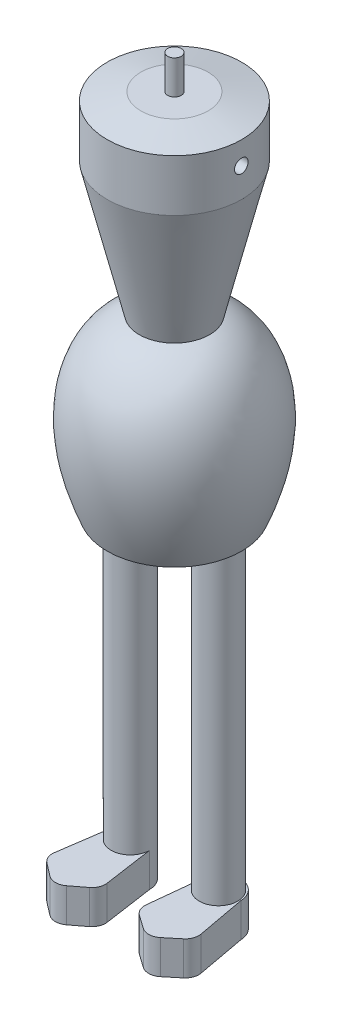
ISO-10303-21;
HEADER;
FILE_DESCRIPTION(('STEP AP214'),'2;1');
FILE_NAME('part.step','',(''),(''),'','','');
FILE_SCHEMA(('AUTOMOTIVE_DESIGN { 1 0 10303 214 1 1 1 1 }'));
ENDSEC;
DATA;
#1=APPLICATION_CONTEXT('core data for automotive mechanical design processes');
#2=APPLICATION_PROTOCOL_DEFINITION('international standard','automotive_design',2000,#1);
#3=PRODUCT_CONTEXT('',#1,'mechanical');
#4=PRODUCT('Part','Part','',(#3));
#5=PRODUCT_RELATED_PRODUCT_CATEGORY('part','',(#4));
#6=PRODUCT_DEFINITION_FORMATION('','',#4);
#7=PRODUCT_DEFINITION_CONTEXT('part definition',#1,'design');
#8=PRODUCT_DEFINITION('design','',#6,#7);
#9=PRODUCT_DEFINITION_SHAPE('','',#8);
#10=(LENGTH_UNIT() NAMED_UNIT(*) SI_UNIT(.MILLI.,.METRE.));
#11=(NAMED_UNIT(*) PLANE_ANGLE_UNIT() SI_UNIT($,.RADIAN.));
#12=(NAMED_UNIT(*) SI_UNIT($,.STERADIAN.) SOLID_ANGLE_UNIT());
#13=UNCERTAINTY_MEASURE_WITH_UNIT(LENGTH_MEASURE(1.E-05),#10,'distance_accuracy_value','');
#14=(GEOMETRIC_REPRESENTATION_CONTEXT(3) GLOBAL_UNCERTAINTY_ASSIGNED_CONTEXT((#13)) GLOBAL_UNIT_ASSIGNED_CONTEXT((#10,
#11,#12)) REPRESENTATION_CONTEXT('',''));
#15=CARTESIAN_POINT('',(0.,0.,0.));
#16=DIRECTION('',(0.,0.,1.));
#17=DIRECTION('',(1.,0.,0.));
#18=AXIS2_PLACEMENT_3D('',#15,#16,#17);
#19=CARTESIAN_POINT('',(0.,53.6546413411295,0.));
#20=DIRECTION('',(0.,1.,0.));
#21=DIRECTION('',(0.,0.,1.));
#22=AXIS2_PLACEMENT_3D('',#19,#20,#21);
#23=CYLINDRICAL_SURFACE('',#22,9.91246763759848);
#24=CARTESIAN_POINT('',(0.,27.2820210209133,0.));
#25=DIRECTION('',(0.,1.,0.));
#26=DIRECTION('',(0.,0.,1.));
#27=AXIS2_PLACEMENT_3D('',#24,#25,#26);
#28=CIRCLE('',#27,9.91246763759848);
#29=CARTESIAN_POINT('',(0.,27.2820210209133,9.91246763759848));
#30=VERTEX_POINT('',#29);
#31=EDGE_CURVE('E468',#30,#30,#28,.T.);
#32=ORIENTED_EDGE('',*,*,#31,.F.);
#33=EDGE_LOOP('',(#32));
#34=FACE_BOUND('',#33,.T.);
#35=CARTESIAN_POINT('',(0.,19.6430551350576,0.));
#36=DIRECTION('',(0.,1.,0.));
#37=DIRECTION('',(0.,0.,1.));
#38=AXIS2_PLACEMENT_3D('',#35,#36,#37);
#39=CIRCLE('',#38,9.91246763759848);
#40=CARTESIAN_POINT('',(0.,19.6430551350576,9.91246763759848));
#41=VERTEX_POINT('',#40);
#42=EDGE_CURVE('E471',#41,#41,#39,.T.);
#43=ORIENTED_EDGE('',*,*,#42,.T.);
#44=EDGE_LOOP('',(#43));
#45=FACE_BOUND('',#44,.T.);
#46=CARTESIAN_POINT('',(-9.8618971129513,23.9362823058489,1.));
#47=CARTESIAN_POINT('',(-9.86189777524261,23.9922991898953,0.999997574784623));
#48=CARTESIAN_POINT('',(-9.86237953195626,24.0483530484495,0.995277309922573));
#49=CARTESIAN_POINT('',(-9.8642542243653,24.1589064662983,0.976518656409124));
#50=CARTESIAN_POINT('',(-9.86564816255343,24.2134042466029,0.962470015568449));
#51=CARTESIAN_POINT('',(-9.86918775384349,24.3192285294165,0.925468018658358));
#52=CARTESIAN_POINT('',(-9.87133294942783,24.3705569397501,0.902520081370942));
#53=CARTESIAN_POINT('',(-9.87613278323589,24.4686224840881,0.848381344987756));
#54=CARTESIAN_POINT('',(-9.87878732069727,24.5153605234383,0.817192175782723));
#55=CARTESIAN_POINT('',(-9.8843177359631,24.6031025022267,0.747332408466979));
#56=CARTESIAN_POINT('',(-9.88719431306254,24.6440870759646,0.708637540536115));
#57=CARTESIAN_POINT('',(-9.89283834324895,24.7189919491841,0.624916651579463));
#58=CARTESIAN_POINT('',(-9.89560579132496,24.7529119245803,0.579890340260151));
#59=CARTESIAN_POINT('',(-9.90072665926403,24.8127917383258,0.484665983732102));
#60=CARTESIAN_POINT('',(-9.90307918258635,24.8387344276271,0.434457102393798));
#61=CARTESIAN_POINT('',(-9.90709752356021,24.8818135341651,0.330368065721891));
#62=CARTESIAN_POINT('',(-9.90876335822507,24.898950169582,0.27648800138359));
#63=CARTESIAN_POINT('',(-9.91121571892736,24.9238738977643,0.166781773045071));
#64=CARTESIAN_POINT('',(-9.91200523631881,24.9316928038528,0.110962904517751));
#65=CARTESIAN_POINT('',(-9.91262617960286,24.9378575642681,-0.00120002986843441));
#66=CARTESIAN_POINT('',(-9.91245763074357,24.9362036682335,-0.0575440818479688));
#67=CARTESIAN_POINT('',(-9.91118388014935,24.9234955877367,-0.168942001858916));
#68=CARTESIAN_POINT('',(-9.91008208711724,24.9124756126638,-0.223999816858196));
#69=CARTESIAN_POINT('',(-9.90706958396251,24.8814014901214,-0.331480436251494));
#70=CARTESIAN_POINT('',(-9.90515886317269,24.8613472235181,-0.383903205887446));
#71=CARTESIAN_POINT('',(-9.90073745853246,24.8127363117825,-0.484733414427269));
#72=CARTESIAN_POINT('',(-9.89822570879733,24.784164539039,-0.533133511575995));
#73=CARTESIAN_POINT('',(-9.89288405868692,24.7193406483162,-0.62446436276818));
#74=CARTESIAN_POINT('',(-9.89005414881522,24.6830883010593,-0.667394953476764));
#75=CARTESIAN_POINT('',(-9.88437884810208,24.6037399640181,-0.7467685377382));
#76=CARTESIAN_POINT('',(-9.88153344444583,24.5606142136038,-0.783181785742086));
#77=CARTESIAN_POINT('',(-9.87616042506852,24.4688464058732,-0.848256728938907));
#78=CARTESIAN_POINT('',(-9.87363280982196,24.4202043403207,-0.876918412558173));
#79=CARTESIAN_POINT('',(-9.86918132843441,24.3187616972321,-0.92567654176949));
#80=CARTESIAN_POINT('',(-9.86725759306286,24.2659602220734,-0.945771132505041));
#81=CARTESIAN_POINT('',(-9.86423436606986,24.157708973625,-0.976801034542922));
#82=CARTESIAN_POINT('',(-9.86313484888217,24.1022592825365,-0.987736629947264));
#83=CARTESIAN_POINT('',(-9.86188897631334,23.9905467997434,-1.00009982093608));
#84=CARTESIAN_POINT('',(-9.86173844847355,23.9342886589577,-1.0015690383443));
#85=CARTESIAN_POINT('',(-9.86239658543658,23.8223269800234,-0.995067091682364));
#86=CARTESIAN_POINT('',(-9.86320523704464,23.7666234342563,-0.987096057475102));
#87=CARTESIAN_POINT('',(-9.8656868208889,23.657473594568,-0.961974705950307));
#88=CARTESIAN_POINT('',(-9.86735789842471,23.6040227218857,-0.94484408405558));
#89=CARTESIAN_POINT('',(-9.8713745387021,23.5007531461725,-0.901909945356364));
#90=CARTESIAN_POINT('',(-9.87372011715904,23.4509345278042,-0.876106226473165));
#91=CARTESIAN_POINT('',(-9.87883156576801,23.3561539596966,-0.81645416132579));
#92=CARTESIAN_POINT('',(-9.88159886443457,23.3112094411516,-0.782578243120618));
#93=CARTESIAN_POINT('',(-9.88723727601645,23.2276296814586,-0.70778289424361));
#94=CARTESIAN_POINT('',(-9.89010839154662,23.1889945993628,-0.666863286063678));
#95=CARTESIAN_POINT('',(-9.89564353352538,23.1189868035289,-0.578961510574311));
#96=CARTESIAN_POINT('',(-9.89830676173301,23.0876412482795,-0.531957656097865));
#97=CARTESIAN_POINT('',(-9.90311442136439,23.0332892111111,-0.433328724451929));
#98=CARTESIAN_POINT('',(-9.90525886000604,23.0102826131702,-0.381703711590149));
#99=CARTESIAN_POINT('',(-9.90878371501308,22.9733075435076,-0.275392566801817));
#100=CARTESIAN_POINT('',(-9.91016551546472,22.9593226906823,-0.220712179988747));
#101=CARTESIAN_POINT('',(-9.91201508266067,22.9407346336477,-0.10976475005734));
#102=CARTESIAN_POINT('',(-9.91248287558134,22.9361311607637,-0.0534977524249416));
#103=CARTESIAN_POINT('',(-9.91245170299397,22.9364403557481,0.0587589733248549));
#104=CARTESIAN_POINT('',(-9.91195701976338,22.9413108716411,0.114748823503551));
#105=CARTESIAN_POINT('',(-9.91006493145315,22.9603413704608,0.225110605340522));
#106=CARTESIAN_POINT('',(-9.90866752569962,22.9745013603222,0.279482535790954));
#107=CARTESIAN_POINT('',(-9.9051265534781,23.011697129178,0.385064567918011));
#108=CARTESIAN_POINT('',(-9.90298309279396,23.0347316498934,0.436275116638658));
#109=CARTESIAN_POINT('',(-9.89818889275895,23.0890181247579,0.534109686274732));
#110=CARTESIAN_POINT('',(-9.89553815608645,23.1202700355203,0.580733731404465));
#111=CARTESIAN_POINT('',(-9.89001222635786,23.1902621617522,0.668287803274798));
#112=CARTESIAN_POINT('',(-9.88713612372187,23.2290337639266,0.709192682108379));
#113=CARTESIAN_POINT('',(-9.88149129461868,23.3129026738614,0.783934460090197));
#114=CARTESIAN_POINT('',(-9.8787225940728,23.3580014967101,0.817769661519823));
#115=CARTESIAN_POINT('',(-9.87359839418046,23.4533723860685,0.877480840334768));
#116=CARTESIAN_POINT('',(-9.87124398069672,23.50365751523,0.903336031557831));
#117=CARTESIAN_POINT('',(-9.86722786151464,23.6078473120377,0.946201212242865));
#118=CARTESIAN_POINT('',(-9.86556537578326,23.6617478238778,0.963221167342472));
#119=CARTESIAN_POINT('',(-9.8635401094935,23.7526743221321,0.983693815763366));
#120=CARTESIAN_POINT('',(-9.86292690433524,23.7891192279565,0.989800264303532));
#121=CARTESIAN_POINT('',(-9.86210518869802,23.8624648395252,0.997954146854487));
#122=CARTESIAN_POINT('',(-9.86189667648198,23.8993655433123,1.00000159828776));
#123=CARTESIAN_POINT('',(-9.8618971129513,23.9362823058489,1.));
#124=B_SPLINE_CURVE_WITH_KNOTS('',3,(#46,#47,#48,#49,#50,#51,#52,#53,#54,#55,#56,#57,#58,#59,
#60,#61,#62,#63,#64,#65,#66,#67,#68,#69,#70,#71,#72,#73,#74,#75,#76,#77,#78,#79,#80,#81,#82,#83,
#84,#85,#86,#87,#88,#89,#90,#91,#92,#93,#94,#95,#96,#97,#98,#99,#100,#101,#102,#103,#104,#105,
#106,#107,#108,#109,#110,#111,#112,#113,#114,#115,#116,#117,#118,#119,#120,#121,#122,#123),
.UNSPECIFIED.,.T.,.F.,(4,2,2,2,2,2,2,2,2,2,2,2,2,2,2,2,2,2,2,2,2,2,2,2,2,2,2,2,2,2,2,2,2,2,2,2,
2,2,4),(0.,0.167915837051277,0.336016525208888,0.504015017156937,0.671980308424872,
0.840498055771571,1.00902353209383,1.17790880075623,1.34678988488751,1.51509269466586,
1.68339106914753,1.85107736634687,2.01876587486402,2.18675400100522,2.35474714256993,
2.5234884798402,2.69223006905262,2.86100817388186,3.02978104320506,3.19781134171247,
3.3658393287722,3.53350745776932,3.70117949361865,3.8694326646841,4.03769007652019,
4.2065646636003,4.37543690099895,4.54400164154351,4.71256155447358,4.88037322040368,
5.04818501160874,5.21597301830353,5.38376013911909,5.55226328010106,5.72080683918862,
5.88978578238165,6.05857371063425,6.16923562616035,6.27989706668988),.UNSPECIFIED.);
#125=CARTESIAN_POINT('',(-9.8618971129513,23.9362823058489,1.));
#126=VERTEX_POINT('',#125);
#127=EDGE_CURVE('E268',#126,#126,#124,.T.);
#128=ORIENTED_EDGE('',*,*,#127,.F.);
#129=EDGE_LOOP('',(#128));
#130=FACE_BOUND('',#129,.T.);
#131=CARTESIAN_POINT('',(9.8618971129513,23.9362823058489,1.));
#132=CARTESIAN_POINT('',(9.86189777524261,23.8802654218025,0.999997574784623));
#133=CARTESIAN_POINT('',(9.86237953195626,23.8242115632483,0.995277309922573));
#134=CARTESIAN_POINT('',(9.8642542243653,23.7136581453995,0.976518656409123));
#135=CARTESIAN_POINT('',(9.86564816255343,23.6591603650949,0.962470015568448));
#136=CARTESIAN_POINT('',(9.86918775384349,23.5533360822813,0.925468018658357));
#137=CARTESIAN_POINT('',(9.87133294942783,23.5020076719477,0.902520081370941));
#138=CARTESIAN_POINT('',(9.87613278323589,23.4039421276096,0.848381344987754));
#139=CARTESIAN_POINT('',(9.87878732069727,23.3572040882595,0.817192175782721));
#140=CARTESIAN_POINT('',(9.8843177359631,23.2694621094711,0.747332408466976));
#141=CARTESIAN_POINT('',(9.88719431306254,23.2284775357331,0.708637540536111));
#142=CARTESIAN_POINT('',(9.89283834324895,23.1535726625137,0.624916651579459));
#143=CARTESIAN_POINT('',(9.89560579132496,23.1196526871175,0.579890340260147));
#144=CARTESIAN_POINT('',(9.90072665926403,23.0597728733719,0.484665983732097));
#145=CARTESIAN_POINT('',(9.90307918258635,23.0338301840706,0.434457102393793));
#146=CARTESIAN_POINT('',(9.90709752356021,22.9907510775327,0.330368065721886));
#147=CARTESIAN_POINT('',(9.90876335822508,22.9736144421158,0.276488001383585));
#148=CARTESIAN_POINT('',(9.91121571892737,22.9486907139335,0.166781773045067));
#149=CARTESIAN_POINT('',(9.91200523631882,22.940871807845,0.110962904517746));
#150=CARTESIAN_POINT('',(9.91262617960286,22.9347070474297,-0.00120002986843953));
#151=CARTESIAN_POINT('',(9.91245763074357,22.9363609434643,-0.0575440818479738));
#152=CARTESIAN_POINT('',(9.91118388014935,22.9490690239611,-0.16894200185892));
#153=CARTESIAN_POINT('',(9.91008208711724,22.960088999034,-0.2239998168582));
#154=CARTESIAN_POINT('',(9.90706958396251,22.9911631215764,-0.331480436251497));
#155=CARTESIAN_POINT('',(9.90515886317269,23.0112173881797,-0.383903205887448));
#156=CARTESIAN_POINT('',(9.90073745853246,23.0598282999153,-0.48473341442727));
#157=CARTESIAN_POINT('',(9.89822570879733,23.0884000726588,-0.533133511575996));
#158=CARTESIAN_POINT('',(9.89288405868691,23.1532239633816,-0.624464362768181));
#159=CARTESIAN_POINT('',(9.89005414881522,23.1894763106384,-0.667394953476764));
#160=CARTESIAN_POINT('',(9.88437884810208,23.2688246476797,-0.7467685377382));
#161=CARTESIAN_POINT('',(9.88153344444583,23.3119503980939,-0.783181785742086));
#162=CARTESIAN_POINT('',(9.87616042506852,23.4037182058246,-0.848256728938907));
#163=CARTESIAN_POINT('',(9.87363280982196,23.452360271377,-0.876918412558173));
#164=CARTESIAN_POINT('',(9.86918132843441,23.5538029144657,-0.92567654176949));
#165=CARTESIAN_POINT('',(9.86725759306286,23.6066043896244,-0.945771132505042));
#166=CARTESIAN_POINT('',(9.86423436606986,23.7148556380728,-0.976801034542923));
#167=CARTESIAN_POINT('',(9.86313484888217,23.7703053291612,-0.987736629947264));
#168=CARTESIAN_POINT('',(9.86188897631334,23.8820178119544,-1.00009982093608));
#169=CARTESIAN_POINT('',(9.86173844847355,23.9382759527401,-1.0015690383443));
#170=CARTESIAN_POINT('',(9.86239658543658,24.0502376316744,-0.995067091682364));
#171=CARTESIAN_POINT('',(9.86320523704464,24.1059411774415,-0.987096057475102));
#172=CARTESIAN_POINT('',(9.8656868208889,24.2150910171298,-0.961974705950306));
#173=CARTESIAN_POINT('',(9.86735789842471,24.268541889812,-0.944844084055579));
#174=CARTESIAN_POINT('',(9.8713745387021,24.3718114655252,-0.901909945356362));
#175=CARTESIAN_POINT('',(9.87372011715904,24.4216300838936,-0.876106226473162));
#176=CARTESIAN_POINT('',(9.87883156576801,24.5164106520011,-0.816454161325785));
#177=CARTESIAN_POINT('',(9.88159886443457,24.5613551705462,-0.782578243120612));
#178=CARTESIAN_POINT('',(9.88723727601645,24.6449349302391,-0.707782894243604));
#179=CARTESIAN_POINT('',(9.89010839154662,24.683570012335,-0.666863286063674));
#180=CARTESIAN_POINT('',(9.89564353352538,24.7535778081689,-0.578961510574306));
#181=CARTESIAN_POINT('',(9.89830676173301,24.7849233634182,-0.53195765609786));
#182=CARTESIAN_POINT('',(9.90311442136439,24.8392754005867,-0.433328724451924));
#183=CARTESIAN_POINT('',(9.90525886000604,24.8622819985276,-0.381703711590145));
#184=CARTESIAN_POINT('',(9.90878371501308,24.8992570681902,-0.275392566801813));
#185=CARTESIAN_POINT('',(9.91016551546472,24.9132419210154,-0.220712179988742));
#186=CARTESIAN_POINT('',(9.91201508266067,24.9318299780501,-0.109764750057335));
#187=CARTESIAN_POINT('',(9.91248287558134,24.9364334509341,-0.0534977524249364));
#188=CARTESIAN_POINT('',(9.91245170299397,24.9361242559497,0.0587589733248594));
#189=CARTESIAN_POINT('',(9.91195701976338,24.9312537400567,0.114748823503555));
#190=CARTESIAN_POINT('',(9.91006493145315,24.912223241237,0.225110605340524));
#191=CARTESIAN_POINT('',(9.90866752569962,24.8980632513755,0.279482535790957));
#192=CARTESIAN_POINT('',(9.9051265534781,24.8608674825198,0.385064567918013));
#193=CARTESIAN_POINT('',(9.90298309279396,24.8378329618044,0.43627511663866));
#194=CARTESIAN_POINT('',(9.89818889275895,24.7835464869399,0.534109686274733));
#195=CARTESIAN_POINT('',(9.89553815608645,24.7522945761775,0.580733731404466));
#196=CARTESIAN_POINT('',(9.89001222635786,24.6823024499456,0.668287803274798));
#197=CARTESIAN_POINT('',(9.88713612372187,24.6435308477712,0.709192682108379));
#198=CARTESIAN_POINT('',(9.88149129461868,24.5596619378364,0.783934460090198));
#199=CARTESIAN_POINT('',(9.8787225940728,24.5145631149877,0.817769661519824));
#200=CARTESIAN_POINT('',(9.87359839418046,24.4191922256293,0.877480840334768));
#201=CARTESIAN_POINT('',(9.87124398069672,24.3689070964677,0.90333603155783));
#202=CARTESIAN_POINT('',(9.86722786151464,24.26471729966,0.946201212242864));
#203=CARTESIAN_POINT('',(9.86556537578326,24.21081678782,0.963221167342472));
#204=CARTESIAN_POINT('',(9.8635401094935,24.1198902895657,0.983693815763366));
#205=CARTESIAN_POINT('',(9.86292690433524,24.0834453837412,0.989800264303531));
#206=CARTESIAN_POINT('',(9.86210518869802,24.0100997721725,0.997954146854487));
#207=CARTESIAN_POINT('',(9.86189667648198,23.9731990683854,1.00000159828776));
#208=CARTESIAN_POINT('',(9.8618971129513,23.9362823058489,1.));
#209=B_SPLINE_CURVE_WITH_KNOTS('',3,(#131,#132,#133,#134,#135,#136,#137,#138,#139,#140,#141,
#142,#143,#144,#145,#146,#147,#148,#149,#150,#151,#152,#153,#154,#155,#156,#157,#158,#159,#160,
#161,#162,#163,#164,#165,#166,#167,#168,#169,#170,#171,#172,#173,#174,#175,#176,#177,#178,#179,
#180,#181,#182,#183,#184,#185,#186,#187,#188,#189,#190,#191,#192,#193,#194,#195,#196,#197,#198,
#199,#200,#201,#202,#203,#204,#205,#206,#207,#208),.UNSPECIFIED.,.T.,.F.,(4,2,2,2,2,2,2,2,2,2,2,
2,2,2,2,2,2,2,2,2,2,2,2,2,2,2,2,2,2,2,2,2,2,2,2,2,2,2,4),(0.,0.167915837051281,
0.336016525208891,0.504015017156938,0.671980308424876,0.840498055771576,1.00902353209383,
1.17790880075624,1.34678988488751,1.51509269466586,1.68339106914754,1.85107736634688,
2.01876587486402,2.18675400100522,2.35474714256993,2.5234884798402,2.69223006905262,
2.86100817388186,3.02978104320507,3.19781134171247,3.36583932877221,3.53350745776933,
3.70117949361866,3.8694326646841,4.0376900765202,4.20656466360031,4.37543690099895,
4.54400164154351,4.71256155447358,4.88037322040369,5.04818501160875,5.21597301830354,
5.38376013911909,5.55226328010106,5.72080683918862,5.88978578238165,6.05857371063425,
6.16923562616034,6.27989706668988),.UNSPECIFIED.);
#210=CARTESIAN_POINT('',(9.8618971129513,23.9362823058489,1.));
#211=VERTEX_POINT('',#210);
#212=EDGE_CURVE('E45',#211,#211,#209,.T.);
#213=ORIENTED_EDGE('',*,*,#212,.F.);
#214=EDGE_LOOP('',(#213));
#215=FACE_BOUND('',#214,.T.);
#216=ADVANCED_FACE('F41',(#34,#45,#130,#215),#23,.T.);
#217=CARTESIAN_POINT('',(6.49714255543264,-70.2813394934491,0.));
#218=DIRECTION('',(0.,1.,0.));
#219=DIRECTION('',(0.,0.,1.));
#220=AXIS2_PLACEMENT_3D('',#217,#218,#219);
#221=PLANE('',#220);
#222=CARTESIAN_POINT('',(6.6473711879431,-70.2813394934491,-0.2558870503321));
#223=DIRECTION('',(0.,-1.,0.));
#224=DIRECTION('',(0.,0.,1.));
#225=AXIS2_PLACEMENT_3D('',#222,#223,#224);
#226=CIRCLE('',#225,2.83366023965534);
#227=CARTESIAN_POINT('',(3.81585789262201,-70.2813394934491,-0.145601909794655));
#228=VERTEX_POINT('',#227);
#229=CARTESIAN_POINT('',(4.13195726197364,-70.2813394934491,-1.56061810876614));
#230=VERTEX_POINT('',#229);
#231=EDGE_CURVE('E217',#228,#230,#226,.T.);
#232=ORIENTED_EDGE('',*,*,#231,.F.);
#233=DIRECTION('',(0.105003114397173,0.,-0.994471892999945));
#234=VECTOR('',#233,1.);
#235=CARTESIAN_POINT('',(3.81585789262201,-70.2813394934491,-0.145601909794655));
#236=LINE('',#235,#234);
#237=CARTESIAN_POINT('',(3.73410339693447,-70.2813394934491,0.628685105922907));
#238=VERTEX_POINT('',#237);
#239=EDGE_CURVE('E208',#238,#228,#236,.T.);
#240=ORIENTED_EDGE('',*,*,#239,.F.);
#241=CARTESIAN_POINT('',(6.49714255543264,-70.2813394934491,0.));
#242=DIRECTION('',(0.,-1.,0.));
#243=DIRECTION('',(0.,0.,1.));
#244=AXIS2_PLACEMENT_3D('',#241,#242,#243);
#245=CIRCLE('',#244,2.83366023965534);
#246=EDGE_CURVE('E192',#238,#230,#245,.T.);
#247=ORIENTED_EDGE('',*,*,#246,.T.);
#248=EDGE_LOOP('',(#232,#240,#247));
#249=FACE_BOUND('',#248,.T.);
#250=ADVANCED_FACE('F264',(#249),#221,.F.);
#251=CARTESIAN_POINT('',(0.,28.4751884217354,0.));
#252=DIRECTION('',(0.,-1.,0.));
#253=DIRECTION('',(0.,0.,-1.));
#254=AXIS2_PLACEMENT_3D('',#251,#252,#253);
#255=PLANE('',#254);
#256=CARTESIAN_POINT('',(0.,28.4751884217354,0.));
#257=DIRECTION('',(0.,1.,0.));
#258=DIRECTION('',(0.,0.,1.));
#259=AXIS2_PLACEMENT_3D('',#256,#257,#258);
#260=CIRCLE('',#259,1.);
#261=CARTESIAN_POINT('',(0.,28.4751884217354,1.));
#262=VERTEX_POINT('',#261);
#263=EDGE_CURVE('E11',#262,#262,#260,.T.);
#264=ORIENTED_EDGE('',*,*,#263,.F.);
#265=EDGE_LOOP('',(#264));
#266=FACE_BOUND('',#265,.T.);
#267=CARTESIAN_POINT('',(0.,28.4751884217354,0.));
#268=DIRECTION('',(0.,1.,0.));
#269=DIRECTION('',(0.,0.,1.));
#270=AXIS2_PLACEMENT_3D('',#267,#268,#269);
#271=CIRCLE('',#270,4.95623381879924);
#272=CARTESIAN_POINT('',(0.,28.4751884217354,4.95623381879924));
#273=VERTEX_POINT('',#272);
#274=EDGE_CURVE('E357',#273,#273,#271,.T.);
#275=ORIENTED_EDGE('',*,*,#274,.T.);
#276=EDGE_LOOP('',(#275));
#277=FACE_BOUND('',#276,.T.);
#278=ADVANCED_FACE('F340',(#266,#277),#255,.F.);
#279=CARTESIAN_POINT('',(0.,27.2820210209133,0.));
#280=DIRECTION('',(0.,-1.,0.));
#281=DIRECTION('',(0.,0.,-1.));
#282=AXIS2_PLACEMENT_3D('',#279,#280,#281);
#283=CONICAL_SURFACE('',#282,9.91246763759848,1.33455106607646);
#284=ORIENTED_EDGE('',*,*,#274,.F.);
#285=EDGE_LOOP('',(#284));
#286=FACE_BOUND('',#285,.T.);
#287=ORIENTED_EDGE('',*,*,#31,.T.);
#288=EDGE_LOOP('',(#287));
#289=FACE_BOUND('',#288,.T.);
#290=ADVANCED_FACE('F259',(#286,#289),#283,.T.);
#291=CARTESIAN_POINT('',(0.,0.,0.));
#292=DIRECTION('',(0.,1.,0.));
#293=DIRECTION('',(0.,0.,1.));
#294=AXIS2_PLACEMENT_3D('',#291,#292,#293);
#295=CONICAL_SURFACE('',#294,5.18358399397353,0.236245260718436);
#296=ORIENTED_EDGE('',*,*,#42,.F.);
#297=EDGE_LOOP('',(#296));
#298=FACE_BOUND('',#297,.T.);
#299=CARTESIAN_POINT('',(0.,0.,0.));
#300=DIRECTION('',(0.,1.,0.));
#301=DIRECTION('',(0.,0.,1.));
#302=AXIS2_PLACEMENT_3D('',#299,#300,#301);
#303=CIRCLE('',#302,5.18358399397353);
#304=CARTESIAN_POINT('',(0.,0.,5.18358399397353));
#305=VERTEX_POINT('',#304);
#306=EDGE_CURVE('E473',#305,#305,#303,.T.);
#307=ORIENTED_EDGE('',*,*,#306,.T.);
#308=EDGE_LOOP('',(#307));
#309=FACE_BOUND('',#308,.T.);
#310=ADVANCED_FACE('F255',(#298,#309),#295,.T.);
#311=CARTESIAN_POINT('',(-5.18358399397353,0.,0.));
#312=CARTESIAN_POINT('',(-8.57397898680744,-1.18888393522603,0.));
#313=CARTESIAN_POINT('',(-14.4922180718043,-9.39255896973497,0.));
#314=CARTESIAN_POINT('',(-12.1771908552131,-19.8409918904987,0.));
#315=CARTESIAN_POINT('',(-9.91246762974888,-25.2813394934491,0.));
#316=B_SPLINE_CURVE_WITH_KNOTS('',3,(#311,#312,#313,#314,#315),.UNSPECIFIED.,.F.,.F.,(4,1,4),
(0.,0.353823055643961,1.),.UNSPECIFIED.);
#317=CARTESIAN_POINT('',(0.,53.6546413411295,0.));
#318=DIRECTION('',(0.,1.,0.));
#319=AXIS1_PLACEMENT('',#317,#318);
#320=SURFACE_OF_REVOLUTION('',#316,#319);
#321=CARTESIAN_POINT('',(0.,-25.2813394934491,0.));
#322=DIRECTION('',(0.,1.,0.));
#323=DIRECTION('',(0.,0.,1.));
#324=AXIS2_PLACEMENT_3D('',#321,#322,#323);
#325=CIRCLE('',#324,9.91246762974888);
#326=CARTESIAN_POINT('',(0.,-25.2813394934491,9.91246762974888));
#327=VERTEX_POINT('',#326);
#328=EDGE_CURVE('E233',#327,#327,#325,.T.);
#329=ORIENTED_EDGE('',*,*,#328,.T.);
#330=EDGE_LOOP('',(#329));
#331=FACE_BOUND('',#330,.T.);
#332=ORIENTED_EDGE('',*,*,#306,.F.);
#333=EDGE_LOOP('',(#332));
#334=FACE_BOUND('',#333,.T.);
#335=ADVANCED_FACE('F250',(#331,#334),#320,.F.);
#336=CARTESIAN_POINT('',(0.,-25.2813394934491,0.));
#337=DIRECTION('',(0.,-1.,0.));
#338=DIRECTION('',(0.,0.,-1.));
#339=AXIS2_PLACEMENT_3D('',#336,#337,#338);
#340=PLANE('',#339);
#341=CARTESIAN_POINT('',(-6.49714255543264,-25.2813394934491,0.));
#342=DIRECTION('',(0.,-1.,0.));
#343=DIRECTION('',(0.,0.,-1.));
#344=AXIS2_PLACEMENT_3D('',#341,#342,#343);
#345=CIRCLE('',#344,2.83366023965534);
#346=CARTESIAN_POINT('',(-6.49714255543264,-25.2813394934491,-2.83366023965534));
#347=VERTEX_POINT('',#346);
#348=EDGE_CURVE('E234',#347,#347,#345,.T.);
#349=ORIENTED_EDGE('',*,*,#348,.F.);
#350=EDGE_LOOP('',(#349));
#351=FACE_BOUND('',#350,.T.);
#352=CARTESIAN_POINT('',(6.49714255543264,-25.2813394934491,0.));
#353=DIRECTION('',(0.,-1.,0.));
#354=DIRECTION('',(0.,0.,1.));
#355=AXIS2_PLACEMENT_3D('',#352,#353,#354);
#356=CIRCLE('',#355,2.83366023965534);
#357=CARTESIAN_POINT('',(6.49714255543264,-25.2813394934491,2.83366023965534));
#358=VERTEX_POINT('',#357);
#359=EDGE_CURVE('E237',#358,#358,#356,.T.);
#360=ORIENTED_EDGE('',*,*,#359,.F.);
#361=EDGE_LOOP('',(#360));
#362=FACE_BOUND('',#361,.T.);
#363=ORIENTED_EDGE('',*,*,#328,.F.);
#364=EDGE_LOOP('',(#363));
#365=FACE_BOUND('',#364,.T.);
#366=ADVANCED_FACE('F254',(#351,#362,#365),#340,.T.);
#367=CARTESIAN_POINT('',(6.49714255543264,-70.2813394934491,0.));
#368=DIRECTION('',(0.,1.,0.));
#369=DIRECTION('',(0.,0.,1.));
#370=AXIS2_PLACEMENT_3D('',#367,#368,#369);
#371=CYLINDRICAL_SURFACE('',#370,2.83366023965534);
#372=ORIENTED_EDGE('',*,*,#246,.F.);
#373=EDGE_CURVE('E188',#230,#238,#245,.T.);
#374=ORIENTED_EDGE('',*,*,#373,.F.);
#375=EDGE_LOOP('',(#372,#374));
#376=FACE_BOUND('',#375,.T.);
#377=ORIENTED_EDGE('',*,*,#359,.T.);
#378=EDGE_LOOP('',(#377));
#379=FACE_BOUND('',#378,.T.);
#380=ADVANCED_FACE('F336',(#376,#379),#371,.T.);
#381=CARTESIAN_POINT('',(-6.49714255543264,-70.2813394934491,0.));
#382=DIRECTION('',(0.,1.,0.));
#383=DIRECTION('',(0.,0.,1.));
#384=AXIS2_PLACEMENT_3D('',#381,#382,#383);
#385=CYLINDRICAL_SURFACE('',#384,2.83366023965534);
#386=CARTESIAN_POINT('',(-6.49714255543264,-70.2813394934491,0.));
#387=DIRECTION('',(0.,-1.,0.));
#388=DIRECTION('',(0.,0.,-1.));
#389=AXIS2_PLACEMENT_3D('',#386,#387,#388);
#390=CIRCLE('',#389,2.83366023965534);
#391=CARTESIAN_POINT('',(-3.6634823157773,-70.2813394934491,0.));
#392=VERTEX_POINT('',#391);
#393=CARTESIAN_POINT('',(-9.33080279508797,-70.2813394934491,0.));
#394=VERTEX_POINT('',#393);
#395=EDGE_CURVE('E186',#392,#394,#390,.T.);
#396=ORIENTED_EDGE('',*,*,#395,.F.);
#397=DIRECTION('',(0.,1.,0.));
#398=VECTOR('',#397,1.);
#399=CARTESIAN_POINT('',(-3.6634823157773,-75.2813394934491,0.));
#400=LINE('',#399,#398);
#401=CARTESIAN_POINT('',(-3.6634823157773,-75.2813394934491,0.));
#402=VERTEX_POINT('',#401);
#403=EDGE_CURVE('E169',#402,#392,#400,.T.);
#404=ORIENTED_EDGE('',*,*,#403,.F.);
#405=CARTESIAN_POINT('',(-6.49714255543263,-75.2813394934491,0.));
#406=DIRECTION('',(0.,-1.,0.));
#407=DIRECTION('',(0.,0.,-1.));
#408=AXIS2_PLACEMENT_3D('',#405,#406,#407);
#409=CIRCLE('',#408,2.83366023965534);
#410=CARTESIAN_POINT('',(-9.33080279508797,-75.2813394934491,0.));
#411=VERTEX_POINT('',#410);
#412=EDGE_CURVE('E171',#411,#402,#409,.T.);
#413=ORIENTED_EDGE('',*,*,#412,.F.);
#414=DIRECTION('',(0.,1.,0.));
#415=VECTOR('',#414,1.);
#416=CARTESIAN_POINT('',(-9.33080279508797,-75.2813394934491,0.));
#417=LINE('',#416,#415);
#418=EDGE_CURVE('E189',#411,#394,#417,.T.);
#419=ORIENTED_EDGE('',*,*,#418,.T.);
#420=EDGE_LOOP('',(#396,#404,#413,#419));
#421=FACE_BOUND('',#420,.T.);
#422=ORIENTED_EDGE('',*,*,#348,.T.);
#423=EDGE_LOOP('',(#422));
#424=FACE_BOUND('',#423,.T.);
#425=ADVANCED_FACE('F183',(#421,#424),#385,.T.);
#426=CARTESIAN_POINT('',(-6.49714255543263,-70.2813394934491,0.));
#427=DIRECTION('',(0.,-1.,0.));
#428=DIRECTION('',(0.,0.,-1.));
#429=AXIS2_PLACEMENT_3D('',#426,#427,#428);
#430=PLANE('',#429);
#431=DIRECTION('',(0.143628082594427,0.,-0.989631736501133));
#432=VECTOR('',#431,1.);
#433=CARTESIAN_POINT('',(-9.33080279508797,-70.2813394934491,0.));
#434=LINE('',#433,#432);
#435=CARTESIAN_POINT('',(-10.3914755888623,-70.2813394934491,7.30828846143132));
#436=VERTEX_POINT('',#435);
#437=EDGE_CURVE('E181',#436,#394,#434,.T.);
#438=ORIENTED_EDGE('',*,*,#437,.F.);
#439=CARTESIAN_POINT('',(-8.41221211585999,-70.2813394934491,7.59554462662017));
#440=DIRECTION('',(0.,-1.,0.));
#441=DIRECTION('',(0.,0.,-1.));
#442=AXIS2_PLACEMENT_3D('',#439,#440,#441);
#443=CIRCLE('',#442,2.);
#444=CARTESIAN_POINT('',(-9.62655578867738,-70.2813394934491,9.18468572931947));
#445=VERTEX_POINT('',#444);
#446=EDGE_CURVE('E380',#436,#445,#443,.F.);
#447=ORIENTED_EDGE('',*,*,#446,.T.);
#448=DIRECTION('',(-0.794570551349653,0.,-0.607171836408696));
#449=VECTOR('',#448,1.);
#450=CARTESIAN_POINT('',(-10.5602523541103,-70.2813394934491,8.47120061799811));
#451=LINE('',#450,#449);
#452=CARTESIAN_POINT('',(-7.71148622825003,-70.2813394934491,10.6480879405894));
#453=VERTEX_POINT('',#452);
#454=EDGE_CURVE('E398',#453,#445,#451,.T.);
#455=ORIENTED_EDGE('',*,*,#454,.F.);
#456=CARTESIAN_POINT('',(-6.49714255543264,-70.2813394934491,9.05894683789013));
#457=DIRECTION('',(0.,-1.,0.));
#458=DIRECTION('',(0.,0.,-1.));
#459=AXIS2_PLACEMENT_3D('',#456,#457,#458);
#460=CIRCLE('',#459,2.);
#461=CARTESIAN_POINT('',(-5.28279888261524,-70.2813394934491,10.6480879405894));
#462=VERTEX_POINT('',#461);
#463=EDGE_CURVE('E396',#453,#462,#460,.F.);
#464=ORIENTED_EDGE('',*,*,#463,.T.);
#465=DIRECTION('',(-0.794570551349653,0.,0.607171836408696));
#466=VECTOR('',#465,1.);
#467=CARTESIAN_POINT('',(-2.43403275675499,-70.2813394934491,8.47120061799811));
#468=LINE('',#467,#466);
#469=CARTESIAN_POINT('',(-3.36772932218788,-70.2813394934491,9.18468572931947));
#470=VERTEX_POINT('',#469);
#471=EDGE_CURVE('E391',#470,#462,#468,.T.);
#472=ORIENTED_EDGE('',*,*,#471,.F.);
#473=CARTESIAN_POINT('',(-4.58207299500528,-70.2813394934491,7.59554462662017));
#474=DIRECTION('',(0.,-1.,0.));
#475=DIRECTION('',(0.,0.,-1.));
#476=AXIS2_PLACEMENT_3D('',#473,#474,#475);
#477=CIRCLE('',#476,2.);
#478=CARTESIAN_POINT('',(-2.60280952200301,-70.2813394934491,7.30828846143132));
#479=VERTEX_POINT('',#478);
#480=EDGE_CURVE('E378',#470,#479,#477,.F.);
#481=ORIENTED_EDGE('',*,*,#480,.T.);
#482=DIRECTION('',(0.143628082594427,0.,0.989631736501133));
#483=VECTOR('',#482,1.);
#484=CARTESIAN_POINT('',(-3.6634823157773,-70.2813394934491,0.));
#485=LINE('',#484,#483);
#486=EDGE_CURVE('E220',#392,#479,#485,.T.);
#487=ORIENTED_EDGE('',*,*,#486,.F.);
#488=ORIENTED_EDGE('',*,*,#395,.T.);
#489=EDGE_LOOP('',(#438,#447,#455,#464,#472,#481,#487,#488));
#490=FACE_BOUND('',#489,.T.);
#491=ADVANCED_FACE('F289',(#490),#430,.F.);
#492=CARTESIAN_POINT('',(-3.6634823157773,-75.2813394934491,0.));
#493=DIRECTION('',(-0.989631736501133,0.,0.143628082594427));
#494=DIRECTION('',(0.143628082594427,0.,0.989631736501133));
#495=AXIS2_PLACEMENT_3D('',#492,#493,#494);
#496=PLANE('',#495);
#497=ORIENTED_EDGE('',*,*,#486,.T.);
#498=DIRECTION('',(0.,1.,0.));
#499=VECTOR('',#498,1.);
#500=CARTESIAN_POINT('',(-2.60280952200301,-75.2813394934491,7.30828846143131));
#501=LINE('',#500,#499);
#502=CARTESIAN_POINT('',(-2.60280952200301,-75.2813394934491,7.30828846143132));
#503=VERTEX_POINT('',#502);
#504=EDGE_CURVE('E55',#479,#503,#501,.F.);
#505=ORIENTED_EDGE('',*,*,#504,.T.);
#506=DIRECTION('',(0.143628082594427,0.,0.989631736501133));
#507=VECTOR('',#506,1.);
#508=CARTESIAN_POINT('',(-3.6634823157773,-75.2813394934491,0.));
#509=LINE('',#508,#507);
#510=EDGE_CURVE('E165',#402,#503,#509,.T.);
#511=ORIENTED_EDGE('',*,*,#510,.F.);
#512=ORIENTED_EDGE('',*,*,#403,.T.);
#513=EDGE_LOOP('',(#497,#505,#511,#512));
#514=FACE_BOUND('',#513,.T.);
#515=ADVANCED_FACE('F167',(#514),#496,.F.);
#516=CARTESIAN_POINT('',(-2.43403275675499,-75.2813394934491,8.47120061799811));
#517=DIRECTION('',(-0.607171836408696,0.,-0.794570551349653));
#518=DIRECTION('',(-0.794570551349653,0.,0.607171836408696));
#519=AXIS2_PLACEMENT_3D('',#516,#517,#518);
#520=PLANE('',#519);
#521=DIRECTION('',(-0.794570551349653,0.,0.607171836408696));
#522=VECTOR('',#521,1.);
#523=CARTESIAN_POINT('',(-2.43403275675499,-75.2813394934491,8.47120061799811));
#524=LINE('',#523,#522);
#525=CARTESIAN_POINT('',(-3.36772932218788,-75.2813394934491,9.18468572931947));
#526=VERTEX_POINT('',#525);
#527=CARTESIAN_POINT('',(-5.28279888261524,-75.2813394934491,10.6480879405894));
#528=VERTEX_POINT('',#527);
#529=EDGE_CURVE('E170',#526,#528,#524,.T.);
#530=ORIENTED_EDGE('',*,*,#529,.F.);
#531=DIRECTION('',(0.,1.,0.));
#532=VECTOR('',#531,1.);
#533=CARTESIAN_POINT('',(-3.36772932218789,-75.2813394934491,9.18468572931947));
#534=LINE('',#533,#532);
#535=EDGE_CURVE('E386',#526,#470,#534,.T.);
#536=ORIENTED_EDGE('',*,*,#535,.T.);
#537=ORIENTED_EDGE('',*,*,#471,.T.);
#538=DIRECTION('',(0.,1.,0.));
#539=VECTOR('',#538,1.);
#540=CARTESIAN_POINT('',(-5.28279888261524,-75.2813394934491,10.6480879405894));
#541=LINE('',#540,#539);
#542=EDGE_CURVE('E446',#462,#528,#541,.F.);
#543=ORIENTED_EDGE('',*,*,#542,.T.);
#544=EDGE_LOOP('',(#530,#536,#537,#543));
#545=FACE_BOUND('',#544,.T.);
#546=ADVANCED_FACE('F299',(#545),#520,.F.);
#547=CARTESIAN_POINT('',(-10.5602523541103,-75.2813394934491,8.47120061799811));
#548=DIRECTION('',(0.607171836408696,0.,-0.794570551349653));
#549=DIRECTION('',(-0.794570551349653,0.,-0.607171836408696));
#550=AXIS2_PLACEMENT_3D('',#547,#548,#549);
#551=PLANE('',#550);
#552=ORIENTED_EDGE('',*,*,#454,.T.);
#553=DIRECTION('',(0.,1.,0.));
#554=VECTOR('',#553,1.);
#555=CARTESIAN_POINT('',(-9.62655578867738,-75.2813394934491,9.18468572931947));
#556=LINE('',#555,#554);
#557=CARTESIAN_POINT('',(-9.62655578867738,-75.2813394934491,9.18468572931947));
#558=VERTEX_POINT('',#557);
#559=EDGE_CURVE('E382',#445,#558,#556,.F.);
#560=ORIENTED_EDGE('',*,*,#559,.T.);
#561=DIRECTION('',(-0.794570551349653,0.,-0.607171836408696));
#562=VECTOR('',#561,1.);
#563=CARTESIAN_POINT('',(-10.5602523541103,-75.2813394934491,8.47120061799811));
#564=LINE('',#563,#562);
#565=CARTESIAN_POINT('',(-7.71148622825003,-75.2813394934491,10.6480879405894));
#566=VERTEX_POINT('',#565);
#567=EDGE_CURVE('E682',#566,#558,#564,.T.);
#568=ORIENTED_EDGE('',*,*,#567,.F.);
#569=DIRECTION('',(0.,1.,0.));
#570=VECTOR('',#569,1.);
#571=CARTESIAN_POINT('',(-7.71148622825003,-75.2813394934491,10.6480879405894));
#572=LINE('',#571,#570);
#573=EDGE_CURVE('E437',#566,#453,#572,.T.);
#574=ORIENTED_EDGE('',*,*,#573,.T.);
#575=EDGE_LOOP('',(#552,#560,#568,#574));
#576=FACE_BOUND('',#575,.T.);
#577=ADVANCED_FACE('F295',(#576),#551,.F.);
#578=CARTESIAN_POINT('',(-9.33080279508797,-75.2813394934491,0.));
#579=DIRECTION('',(0.989631736501133,0.,0.143628082594427));
#580=DIRECTION('',(0.143628082594427,0.,-0.989631736501133));
#581=AXIS2_PLACEMENT_3D('',#578,#579,#580);
#582=PLANE('',#581);
#583=DIRECTION('',(0.143628082594427,0.,-0.989631736501133));
#584=VECTOR('',#583,1.);
#585=CARTESIAN_POINT('',(-9.33080279508797,-75.2813394934491,0.));
#586=LINE('',#585,#584);
#587=CARTESIAN_POINT('',(-10.3914755888623,-75.2813394934491,7.30828846143132));
#588=VERTEX_POINT('',#587);
#589=EDGE_CURVE('E177',#588,#411,#586,.T.);
#590=ORIENTED_EDGE('',*,*,#589,.F.);
#591=DIRECTION('',(0.,1.,0.));
#592=VECTOR('',#591,1.);
#593=CARTESIAN_POINT('',(-10.3914755888623,-75.2813394934491,7.30828846143131));
#594=LINE('',#593,#592);
#595=EDGE_CURVE('E371',#588,#436,#594,.T.);
#596=ORIENTED_EDGE('',*,*,#595,.T.);
#597=ORIENTED_EDGE('',*,*,#437,.T.);
#598=ORIENTED_EDGE('',*,*,#418,.F.);
#599=EDGE_LOOP('',(#590,#596,#597,#598));
#600=FACE_BOUND('',#599,.T.);
#601=ADVANCED_FACE('F288',(#600),#582,.F.);
#602=CARTESIAN_POINT('',(-6.49714255543263,-75.2813394934491,0.));
#603=DIRECTION('',(0.,-1.,0.));
#604=DIRECTION('',(0.,0.,-1.));
#605=AXIS2_PLACEMENT_3D('',#602,#603,#604);
#606=PLANE('',#605);
#607=ORIENTED_EDGE('',*,*,#567,.T.);
#608=CARTESIAN_POINT('',(-8.41221211585999,-75.2813394934491,7.59554462662017));
#609=DIRECTION('',(0.,-1.,0.));
#610=DIRECTION('',(0.,0.,-1.));
#611=AXIS2_PLACEMENT_3D('',#608,#609,#610);
#612=CIRCLE('',#611,2.);
#613=EDGE_CURVE('E385',#558,#588,#612,.T.);
#614=ORIENTED_EDGE('',*,*,#613,.T.);
#615=ORIENTED_EDGE('',*,*,#589,.T.);
#616=ORIENTED_EDGE('',*,*,#412,.T.);
#617=ORIENTED_EDGE('',*,*,#510,.T.);
#618=CARTESIAN_POINT('',(-4.58207299500528,-75.2813394934491,7.59554462662017));
#619=DIRECTION('',(0.,-1.,0.));
#620=DIRECTION('',(0.,0.,-1.));
#621=AXIS2_PLACEMENT_3D('',#618,#619,#620);
#622=CIRCLE('',#621,2.);
#623=EDGE_CURVE('E69',#503,#526,#622,.T.);
#624=ORIENTED_EDGE('',*,*,#623,.T.);
#625=ORIENTED_EDGE('',*,*,#529,.T.);
#626=CARTESIAN_POINT('',(-6.49714255543264,-75.2813394934491,9.05894683789013));
#627=DIRECTION('',(0.,-1.,0.));
#628=DIRECTION('',(0.,0.,-1.));
#629=AXIS2_PLACEMENT_3D('',#626,#627,#628);
#630=CIRCLE('',#629,2.);
#631=EDGE_CURVE('E448',#528,#566,#630,.T.);
#632=ORIENTED_EDGE('',*,*,#631,.T.);
#633=EDGE_LOOP('',(#607,#614,#615,#616,#617,#624,#625,#632));
#634=FACE_BOUND('',#633,.T.);
#635=ADVANCED_FACE('F175',(#634),#606,.T.);
#636=CARTESIAN_POINT('',(6.6473711879431,-75.2813394934491,-0.2558870503321));
#637=DIRECTION('',(0.,1.,0.));
#638=DIRECTION('',(0.,0.,1.));
#639=AXIS2_PLACEMENT_3D('',#636,#637,#638);
#640=CYLINDRICAL_SURFACE('',#639,2.83366023965534);
#641=ORIENTED_EDGE('',*,*,#231,.T.);
#642=CARTESIAN_POINT('',(9.47888448326421,-70.2813394934491,-0.366172190869558));
#643=VERTEX_POINT('',#642);
#644=EDGE_CURVE('E216',#230,#643,#226,.T.);
#645=ORIENTED_EDGE('',*,*,#644,.T.);
#646=DIRECTION('',(0.,1.,0.));
#647=VECTOR('',#646,1.);
#648=CARTESIAN_POINT('',(9.47888448326421,-75.2813394934491,-0.366172190869558));
#649=LINE('',#648,#647);
#650=CARTESIAN_POINT('',(9.47888448326421,-75.2813394934491,-0.366172190869558));
#651=VERTEX_POINT('',#650);
#652=EDGE_CURVE('E197',#651,#643,#649,.T.);
#653=ORIENTED_EDGE('',*,*,#652,.F.);
#654=CARTESIAN_POINT('',(6.6473711879431,-75.2813394934491,-0.2558870503321));
#655=DIRECTION('',(0.,-1.,0.));
#656=DIRECTION('',(0.,0.,1.));
#657=AXIS2_PLACEMENT_3D('',#654,#655,#656);
#658=CIRCLE('',#657,2.83366023965534);
#659=CARTESIAN_POINT('',(3.81585789262201,-75.2813394934491,-0.145601909794655));
#660=VERTEX_POINT('',#659);
#661=EDGE_CURVE('E207',#660,#651,#658,.T.);
#662=ORIENTED_EDGE('',*,*,#661,.F.);
#663=DIRECTION('',(0.,1.,0.));
#664=VECTOR('',#663,1.);
#665=CARTESIAN_POINT('',(3.81585789262201,-75.2813394934491,-0.145601909794655));
#666=LINE('',#665,#664);
#667=EDGE_CURVE('E200',#660,#228,#666,.T.);
#668=ORIENTED_EDGE('',*,*,#667,.T.);
#669=EDGE_LOOP('',(#641,#645,#653,#662,#668));
#670=FACE_BOUND('',#669,.T.);
#671=ADVANCED_FACE('F287',(#670),#640,.T.);
#672=CARTESIAN_POINT('',(9.47888448326421,-75.2813394934491,-0.366172190869558));
#673=DIRECTION('',(-0.983291975907289,0.,0.182035408963034));
#674=DIRECTION('',(0.182035408963034,0.,0.983291975907289));
#675=AXIS2_PLACEMENT_3D('',#672,#673,#674);
#676=PLANE('',#675);
#677=DIRECTION('',(0.182035408963034,0.,0.983291975907289));
#678=VECTOR('',#677,1.);
#679=CARTESIAN_POINT('',(9.47888448326421,-70.2813394934491,-0.366172190869558));
#680=LINE('',#679,#678);
#681=CARTESIAN_POINT('',(10.8231898746818,-70.2813394934491,6.89529804769429));
#682=VERTEX_POINT('',#681);
#683=EDGE_CURVE('E213',#643,#682,#680,.T.);
#684=ORIENTED_EDGE('',*,*,#683,.T.);
#685=DIRECTION('',(0.,1.,0.));
#686=VECTOR('',#685,1.);
#687=CARTESIAN_POINT('',(10.8231898746818,-75.2813394934491,6.89529804769429));
#688=LINE('',#687,#686);
#689=CARTESIAN_POINT('',(10.8231898746818,-75.2813394934491,6.89529804769429));
#690=VERTEX_POINT('',#689);
#691=EDGE_CURVE('E456',#682,#690,#688,.F.);
#692=ORIENTED_EDGE('',*,*,#691,.T.);
#693=DIRECTION('',(0.182035408963034,0.,0.983291975907289));
#694=VECTOR('',#693,1.);
#695=CARTESIAN_POINT('',(9.47888448326421,-75.2813394934491,-0.366172190869558));
#696=LINE('',#695,#694);
#697=EDGE_CURVE('E227',#651,#690,#696,.T.);
#698=ORIENTED_EDGE('',*,*,#697,.F.);
#699=ORIENTED_EDGE('',*,*,#652,.T.);
#700=EDGE_LOOP('',(#684,#692,#698,#699));
#701=FACE_BOUND('',#700,.T.);
#702=ADVANCED_FACE('F308',(#701),#676,.F.);
#703=CARTESIAN_POINT('',(11.0370989301424,-75.2813394934491,8.05076037783336));
#704=DIRECTION('',(-0.637636237038086,0.,-0.770337607296898));
#705=DIRECTION('',(-0.770337607296898,0.,0.637636237038086));
#706=AXIS2_PLACEMENT_3D('',#703,#704,#705);
#707=PLANE('',#706);
#708=DIRECTION('',(-0.770337607296898,0.,0.637636237038086));
#709=VECTOR('',#708,1.);
#710=CARTESIAN_POINT('',(11.0370989301424,-75.2813394934491,8.05076037783336));
#711=LINE('',#710,#709);
#712=CARTESIAN_POINT('',(10.1318783969434,-75.2813394934491,8.80004408021415));
#713=VERTEX_POINT('',#712);
#714=CARTESIAN_POINT('',(8.27521494461579,-75.2813394934491,10.3368714218554));
#715=VERTEX_POINT('',#714);
#716=EDGE_CURVE('E225',#713,#715,#711,.T.);
#717=ORIENTED_EDGE('',*,*,#716,.F.);
#718=DIRECTION('',(0.,1.,0.));
#719=VECTOR('',#718,1.);
#720=CARTESIAN_POINT('',(10.1318783969434,-75.2813394934491,8.80004408021415));
#721=LINE('',#720,#719);
#722=CARTESIAN_POINT('',(10.1318783969434,-70.2813394934491,8.80004408021415));
#723=VERTEX_POINT('',#722);
#724=EDGE_CURVE('E450',#713,#723,#721,.T.);
#725=ORIENTED_EDGE('',*,*,#724,.T.);
#726=DIRECTION('',(-0.770337607296898,0.,0.637636237038086));
#727=VECTOR('',#726,1.);
#728=CARTESIAN_POINT('',(11.0370989301424,-70.2813394934491,8.05076037783336));
#729=LINE('',#728,#727);
#730=CARTESIAN_POINT('',(8.27521494461579,-70.2813394934491,10.3368714218554));
#731=VERTEX_POINT('',#730);
#732=EDGE_CURVE('E211',#723,#731,#729,.T.);
#733=ORIENTED_EDGE('',*,*,#732,.T.);
#734=DIRECTION('',(0.,1.,0.));
#735=VECTOR('',#734,1.);
#736=CARTESIAN_POINT('',(8.27521494461579,-75.2813394934491,10.3368714218554));
#737=LINE('',#736,#735);
#738=EDGE_CURVE('E434',#731,#715,#737,.F.);
#739=ORIENTED_EDGE('',*,*,#738,.T.);
#740=EDGE_LOOP('',(#717,#725,#733,#739));
#741=FACE_BOUND('',#740,.T.);
#742=ADVANCED_FACE('F312',(#741),#707,.F.);
#743=CARTESIAN_POINT('',(2.91703622516224,-75.2813394934491,8.36703021773538));
#744=DIRECTION('',(0.575787379016085,0.,-0.817599470502389));
#745=DIRECTION('',(-0.817599470502389,0.,-0.575787379016085));
#746=AXIS2_PLACEMENT_3D('',#743,#744,#745);
#747=PLANE('',#746);
#748=DIRECTION('',(-0.817599470502389,0.,-0.575787379016085));
#749=VECTOR('',#748,1.);
#750=CARTESIAN_POINT('',(2.91703622516224,-70.2813394934491,8.36703021773538));
#751=LINE('',#750,#749);
#752=CARTESIAN_POINT('',(5.84836771250744,-70.2813394934491,10.4313951482664));
#753=VERTEX_POINT('',#752);
#754=CARTESIAN_POINT('',(3.87779397815364,-70.2813394934491,9.04363558310381));
#755=VERTEX_POINT('',#754);
#756=EDGE_CURVE('E206',#753,#755,#751,.T.);
#757=ORIENTED_EDGE('',*,*,#756,.T.);
#758=DIRECTION('',(0.,1.,0.));
#759=VECTOR('',#758,1.);
#760=CARTESIAN_POINT('',(3.87779397815364,-75.2813394934491,9.04363558310381));
#761=LINE('',#760,#759);
#762=CARTESIAN_POINT('',(3.87779397815364,-75.2813394934491,9.04363558310381));
#763=VERTEX_POINT('',#762);
#764=EDGE_CURVE('E368',#755,#763,#761,.F.);
#765=ORIENTED_EDGE('',*,*,#764,.T.);
#766=DIRECTION('',(-0.817599470502389,0.,-0.575787379016085));
#767=VECTOR('',#766,1.);
#768=CARTESIAN_POINT('',(2.91703622516224,-75.2813394934491,8.36703021773538));
#769=LINE('',#768,#767);
#770=CARTESIAN_POINT('',(5.84836771250744,-75.2813394934491,10.4313951482664));
#771=VERTEX_POINT('',#770);
#772=EDGE_CURVE('E222',#771,#763,#769,.T.);
#773=ORIENTED_EDGE('',*,*,#772,.F.);
#774=DIRECTION('',(0.,1.,0.));
#775=VECTOR('',#774,1.);
#776=CARTESIAN_POINT('',(5.84836771250744,-75.2813394934491,10.4313951482664));
#777=LINE('',#776,#775);
#778=EDGE_CURVE('E356',#771,#753,#777,.T.);
#779=ORIENTED_EDGE('',*,*,#778,.T.);
#780=EDGE_LOOP('',(#757,#765,#773,#779));
#781=FACE_BOUND('',#780,.T.);
#782=ADVANCED_FACE('F316',(#781),#747,.F.);
#783=CARTESIAN_POINT('',(3.81585789262201,-75.2813394934491,-0.145601909794655));
#784=DIRECTION('',(0.994471892999945,0.,0.105003114397173));
#785=DIRECTION('',(0.105003114397173,0.,-0.994471892999945));
#786=AXIS2_PLACEMENT_3D('',#783,#784,#785);
#787=PLANE('',#786);
#788=DIRECTION('',(0.105003114397173,0.,-0.994471892999945));
#789=VECTOR('',#788,1.);
#790=CARTESIAN_POINT('',(3.81585789262201,-75.2813394934491,-0.145601909794655));
#791=LINE('',#790,#789);
#792=CARTESIAN_POINT('',(3.04042495018592,-75.2813394934491,7.19843041330469));
#793=VERTEX_POINT('',#792);
#794=EDGE_CURVE('E203',#793,#660,#791,.T.);
#795=ORIENTED_EDGE('',*,*,#794,.F.);
#796=DIRECTION('',(0.,1.,0.));
#797=VECTOR('',#796,1.);
#798=CARTESIAN_POINT('',(3.04042495018592,-75.2813394934491,7.19843041330469));
#799=LINE('',#798,#797);
#800=CARTESIAN_POINT('',(3.04042495018592,-70.2813394934491,7.19843041330469));
#801=VERTEX_POINT('',#800);
#802=EDGE_CURVE('E363',#793,#801,#799,.T.);
#803=ORIENTED_EDGE('',*,*,#802,.T.);
#804=EDGE_CURVE('E204',#801,#238,#236,.T.);
#805=ORIENTED_EDGE('',*,*,#804,.T.);
#806=ORIENTED_EDGE('',*,*,#239,.T.);
#807=ORIENTED_EDGE('',*,*,#667,.F.);
#808=EDGE_LOOP('',(#795,#803,#805,#806,#807));
#809=FACE_BOUND('',#808,.T.);
#810=ADVANCED_FACE('F320',(#809),#787,.F.);
#811=CARTESIAN_POINT('',(6.6473711879431,-75.2813394934491,-0.2558870503321));
#812=DIRECTION('',(0.,1.,0.));
#813=DIRECTION('',(0.,0.,1.));
#814=AXIS2_PLACEMENT_3D('',#811,#812,#813);
#815=PLANE('',#814);
#816=ORIENTED_EDGE('',*,*,#697,.T.);
#817=CARTESIAN_POINT('',(8.85660592286727,-75.2813394934491,7.25936886562036));
#818=DIRECTION('',(0.,1.,0.));
#819=DIRECTION('',(0.,0.,1.));
#820=AXIS2_PLACEMENT_3D('',#817,#818,#819);
#821=CIRCLE('',#820,2.);
#822=EDGE_CURVE('E369',#690,#713,#821,.F.);
#823=ORIENTED_EDGE('',*,*,#822,.T.);
#824=ORIENTED_EDGE('',*,*,#716,.T.);
#825=CARTESIAN_POINT('',(6.99994247053961,-75.2813394934491,8.79619620726157));
#826=DIRECTION('',(0.,1.,0.));
#827=DIRECTION('',(0.,0.,1.));
#828=AXIS2_PLACEMENT_3D('',#825,#826,#827);
#829=CIRCLE('',#828,2.);
#830=EDGE_CURVE('E432',#715,#771,#829,.F.);
#831=ORIENTED_EDGE('',*,*,#830,.T.);
#832=ORIENTED_EDGE('',*,*,#772,.T.);
#833=CARTESIAN_POINT('',(5.02936873618581,-75.2813394934491,7.40843664209903));
#834=DIRECTION('',(0.,1.,0.));
#835=DIRECTION('',(0.,0.,1.));
#836=AXIS2_PLACEMENT_3D('',#833,#834,#835);
#837=CIRCLE('',#836,2.);
#838=EDGE_CURVE('E361',#763,#793,#837,.F.);
#839=ORIENTED_EDGE('',*,*,#838,.T.);
#840=ORIENTED_EDGE('',*,*,#794,.T.);
#841=ORIENTED_EDGE('',*,*,#661,.T.);
#842=EDGE_LOOP('',(#816,#823,#824,#831,#832,#839,#840,#841));
#843=FACE_BOUND('',#842,.T.);
#844=ADVANCED_FACE('F324',(#843),#815,.F.);
#845=CARTESIAN_POINT('',(6.6473711879431,-70.2813394934491,-0.2558870503321));
#846=DIRECTION('',(0.,1.,0.));
#847=DIRECTION('',(0.,0.,1.));
#848=AXIS2_PLACEMENT_3D('',#845,#846,#847);
#849=PLANE('',#848);
#850=ORIENTED_EDGE('',*,*,#732,.F.);
#851=CARTESIAN_POINT('',(8.85660592286727,-70.2813394934491,7.25936886562036));
#852=DIRECTION('',(0.,1.,0.));
#853=DIRECTION('',(0.,0.,1.));
#854=AXIS2_PLACEMENT_3D('',#851,#852,#853);
#855=CIRCLE('',#854,2.);
#856=EDGE_CURVE('E454',#723,#682,#855,.T.);
#857=ORIENTED_EDGE('',*,*,#856,.T.);
#858=ORIENTED_EDGE('',*,*,#683,.F.);
#859=ORIENTED_EDGE('',*,*,#644,.F.);
#860=ORIENTED_EDGE('',*,*,#373,.T.);
#861=ORIENTED_EDGE('',*,*,#804,.F.);
#862=CARTESIAN_POINT('',(5.02936873618581,-70.2813394934491,7.40843664209903));
#863=DIRECTION('',(0.,1.,0.));
#864=DIRECTION('',(0.,0.,1.));
#865=AXIS2_PLACEMENT_3D('',#862,#863,#864);
#866=CIRCLE('',#865,2.);
#867=EDGE_CURVE('E367',#801,#755,#866,.T.);
#868=ORIENTED_EDGE('',*,*,#867,.T.);
#869=ORIENTED_EDGE('',*,*,#756,.F.);
#870=CARTESIAN_POINT('',(6.99994247053961,-70.2813394934491,8.79619620726157));
#871=DIRECTION('',(0.,1.,0.));
#872=DIRECTION('',(0.,0.,1.));
#873=AXIS2_PLACEMENT_3D('',#870,#871,#872);
#874=CIRCLE('',#873,2.);
#875=EDGE_CURVE('E441',#753,#731,#874,.T.);
#876=ORIENTED_EDGE('',*,*,#875,.T.);
#877=EDGE_LOOP('',(#850,#857,#858,#859,#860,#861,#868,#869,#876));
#878=FACE_BOUND('',#877,.T.);
#879=ADVANCED_FACE('F326',(#878),#849,.T.);
#880=CARTESIAN_POINT('',(6.99994247053961,-75.2813394934491,8.79619620726157));
#881=DIRECTION('',(0.,1.,0.));
#882=DIRECTION('',(0.,0.,1.));
#883=AXIS2_PLACEMENT_3D('',#880,#881,#882);
#884=CYLINDRICAL_SURFACE('',#883,2.);
#885=ORIENTED_EDGE('',*,*,#830,.F.);
#886=ORIENTED_EDGE('',*,*,#738,.F.);
#887=ORIENTED_EDGE('',*,*,#875,.F.);
#888=ORIENTED_EDGE('',*,*,#778,.F.);
#889=EDGE_LOOP('',(#885,#886,#887,#888));
#890=FACE_BOUND('',#889,.T.);
#891=ADVANCED_FACE('F329',(#890),#884,.T.);
#892=CARTESIAN_POINT('',(-6.49714255543264,-75.2813394934491,9.05894683789013));
#893=DIRECTION('',(0.,1.,0.));
#894=DIRECTION('',(0.,0.,1.));
#895=AXIS2_PLACEMENT_3D('',#892,#893,#894);
#896=CYLINDRICAL_SURFACE('',#895,2.);
#897=ORIENTED_EDGE('',*,*,#631,.F.);
#898=ORIENTED_EDGE('',*,*,#542,.F.);
#899=ORIENTED_EDGE('',*,*,#463,.F.);
#900=ORIENTED_EDGE('',*,*,#573,.F.);
#901=EDGE_LOOP('',(#897,#898,#899,#900));
#902=FACE_BOUND('',#901,.T.);
#903=ADVANCED_FACE('F420',(#902),#896,.T.);
#904=CARTESIAN_POINT('',(8.85660592286727,-75.2813394934491,7.25936886562036));
#905=DIRECTION('',(0.,1.,0.));
#906=DIRECTION('',(0.,0.,1.));
#907=AXIS2_PLACEMENT_3D('',#904,#905,#906);
#908=CYLINDRICAL_SURFACE('',#907,2.);
#909=ORIENTED_EDGE('',*,*,#822,.F.);
#910=ORIENTED_EDGE('',*,*,#691,.F.);
#911=ORIENTED_EDGE('',*,*,#856,.F.);
#912=ORIENTED_EDGE('',*,*,#724,.F.);
#913=EDGE_LOOP('',(#909,#910,#911,#912));
#914=FACE_BOUND('',#913,.T.);
#915=ADVANCED_FACE('F414',(#914),#908,.T.);
#916=CARTESIAN_POINT('',(5.02936873618581,-75.2813394934491,7.40843664209903));
#917=DIRECTION('',(0.,1.,0.));
#918=DIRECTION('',(0.,0.,1.));
#919=AXIS2_PLACEMENT_3D('',#916,#917,#918);
#920=CYLINDRICAL_SURFACE('',#919,2.);
#921=ORIENTED_EDGE('',*,*,#838,.F.);
#922=ORIENTED_EDGE('',*,*,#764,.F.);
#923=ORIENTED_EDGE('',*,*,#867,.F.);
#924=ORIENTED_EDGE('',*,*,#802,.F.);
#925=EDGE_LOOP('',(#921,#922,#923,#924));
#926=FACE_BOUND('',#925,.T.);
#927=ADVANCED_FACE('F365',(#926),#920,.T.);
#928=CARTESIAN_POINT('',(-8.41221211585999,-75.2813394934491,7.59554462662017));
#929=DIRECTION('',(0.,1.,0.));
#930=DIRECTION('',(0.,0.,1.));
#931=AXIS2_PLACEMENT_3D('',#928,#929,#930);
#932=CYLINDRICAL_SURFACE('',#931,2.);
#933=ORIENTED_EDGE('',*,*,#613,.F.);
#934=ORIENTED_EDGE('',*,*,#559,.F.);
#935=ORIENTED_EDGE('',*,*,#446,.F.);
#936=ORIENTED_EDGE('',*,*,#595,.F.);
#937=EDGE_LOOP('',(#933,#934,#935,#936));
#938=FACE_BOUND('',#937,.T.);
#939=ADVANCED_FACE('F406',(#938),#932,.T.);
#940=CARTESIAN_POINT('',(-4.58207299500528,-75.2813394934491,7.59554462662017));
#941=DIRECTION('',(0.,1.,0.));
#942=DIRECTION('',(0.,0.,1.));
#943=AXIS2_PLACEMENT_3D('',#940,#941,#942);
#944=CYLINDRICAL_SURFACE('',#943,2.);
#945=ORIENTED_EDGE('',*,*,#623,.F.);
#946=ORIENTED_EDGE('',*,*,#504,.F.);
#947=ORIENTED_EDGE('',*,*,#480,.F.);
#948=ORIENTED_EDGE('',*,*,#535,.F.);
#949=EDGE_LOOP('',(#945,#946,#947,#948));
#950=FACE_BOUND('',#949,.T.);
#951=ADVANCED_FACE('F43',(#950),#944,.T.);
#952=CARTESIAN_POINT('',(115.,23.9362823058489,0.));
#953=DIRECTION('',(-1.,0.,0.));
#954=DIRECTION('',(0.,0.,1.));
#955=AXIS2_PLACEMENT_3D('',#952,#953,#954);
#956=CYLINDRICAL_SURFACE('',#955,1.);
#957=ORIENTED_EDGE('',*,*,#127,.T.);
#958=EDGE_LOOP('',(#957));
#959=FACE_BOUND('',#958,.T.);
#960=ORIENTED_EDGE('',*,*,#212,.T.);
#961=EDGE_LOOP('',(#960));
#962=FACE_BOUND('',#961,.T.);
#963=ADVANCED_FACE('F276',(#959,#962),#956,.F.);
#964=CARTESIAN_POINT('',(0.,33.4751884217354,0.));
#965=DIRECTION('',(0.,-1.,0.));
#966=DIRECTION('',(0.,0.,-1.));
#967=AXIS2_PLACEMENT_3D('',#964,#965,#966);
#968=CYLINDRICAL_SURFACE('',#967,1.);
#969=CARTESIAN_POINT('',(0.,33.4751884217354,0.));
#970=DIRECTION('',(0.,1.,0.));
#971=DIRECTION('',(0.,0.,1.));
#972=AXIS2_PLACEMENT_3D('',#969,#970,#971);
#973=CIRCLE('',#972,1.);
#974=CARTESIAN_POINT('',(0.,33.4751884217354,1.));
#975=VERTEX_POINT('',#974);
#976=EDGE_CURVE('E274',#975,#975,#973,.T.);
#977=ORIENTED_EDGE('',*,*,#976,.F.);
#978=EDGE_LOOP('',(#977));
#979=FACE_BOUND('',#978,.T.);
#980=ORIENTED_EDGE('',*,*,#263,.T.);
#981=EDGE_LOOP('',(#980));
#982=FACE_BOUND('',#981,.T.);
#983=ADVANCED_FACE('F281',(#979,#982),#968,.T.);
#984=CARTESIAN_POINT('',(0.,33.4751884217354,0.));
#985=DIRECTION('',(0.,1.,0.));
#986=DIRECTION('',(0.,0.,1.));
#987=AXIS2_PLACEMENT_3D('',#984,#985,#986);
#988=PLANE('',#987);
#989=ORIENTED_EDGE('',*,*,#976,.T.);
#990=EDGE_LOOP('',(#989));
#991=FACE_BOUND('',#990,.T.);
#992=ADVANCED_FACE('F522',(#991),#988,.T.);
#993=CLOSED_SHELL('',(#216,#250,#278,#290,#310,#335,#366,#380,#425,#491,#515,#546,#577,#601,
#635,#671,#702,#742,#782,#810,#844,#879,#891,#903,#915,#927,#939,#951,#963,#983,#992));
#994=MANIFOLD_SOLID_BREP('B2',#993);
#995=ADVANCED_BREP_SHAPE_REPRESENTATION('',(#18,#994),#14);
#996=SHAPE_DEFINITION_REPRESENTATION(#9,#995);
ENDSEC;
END-ISO-10303-21;
